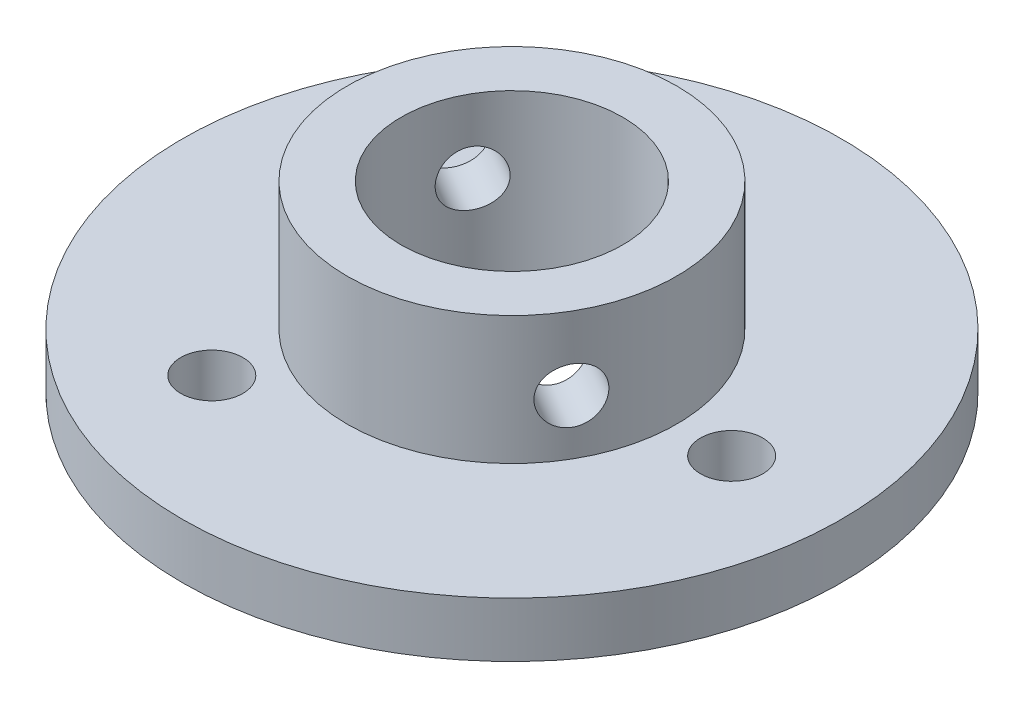
ISO-10303-21;
HEADER;
FILE_DESCRIPTION(('STEP AP214'),'2;1');
FILE_NAME('part.step','',(''),(''),'','','');
FILE_SCHEMA(('AUTOMOTIVE_DESIGN { 1 0 10303 214 1 1 1 1 }'));
ENDSEC;
DATA;
#1=APPLICATION_CONTEXT('core data for automotive mechanical design processes');
#2=APPLICATION_PROTOCOL_DEFINITION('international standard','automotive_design',2000,#1);
#3=PRODUCT_CONTEXT('',#1,'mechanical');
#4=PRODUCT('Part','Part','',(#3));
#5=PRODUCT_RELATED_PRODUCT_CATEGORY('part','',(#4));
#6=PRODUCT_DEFINITION_FORMATION('','',#4);
#7=PRODUCT_DEFINITION_CONTEXT('part definition',#1,'design');
#8=PRODUCT_DEFINITION('design','',#6,#7);
#9=PRODUCT_DEFINITION_SHAPE('','',#8);
#10=(LENGTH_UNIT() NAMED_UNIT(*) SI_UNIT(.MILLI.,.METRE.));
#11=(NAMED_UNIT(*) PLANE_ANGLE_UNIT() SI_UNIT($,.RADIAN.));
#12=(NAMED_UNIT(*) SI_UNIT($,.STERADIAN.) SOLID_ANGLE_UNIT());
#13=UNCERTAINTY_MEASURE_WITH_UNIT(LENGTH_MEASURE(1.E-05),#10,'distance_accuracy_value','');
#14=(GEOMETRIC_REPRESENTATION_CONTEXT(3) GLOBAL_UNCERTAINTY_ASSIGNED_CONTEXT((#13)) GLOBAL_UNIT_ASSIGNED_CONTEXT((#10,
#11,#12)) REPRESENTATION_CONTEXT('',''));
#15=CARTESIAN_POINT('',(0.,0.,0.));
#16=DIRECTION('',(0.,0.,1.));
#17=DIRECTION('',(1.,0.,0.));
#18=AXIS2_PLACEMENT_3D('',#15,#16,#17);
#19=CARTESIAN_POINT('',(-19.0091828831705,263.,-53.2448828787845));
#20=DIRECTION('',(0.,1.,0.));
#21=DIRECTION('',(0.,0.,-1.));
#22=AXIS2_PLACEMENT_3D('',#19,#20,#21);
#23=CYLINDRICAL_SURFACE('',#22,9.);
#24=CARTESIAN_POINT('',(-19.0091828831705,273.,-53.2448828787845));
#25=DIRECTION('',(0.,1.,0.));
#26=DIRECTION('',(0.,0.,1.));
#27=AXIS2_PLACEMENT_3D('',#24,#25,#26);
#28=CIRCLE('',#27,9.);
#29=CARTESIAN_POINT('',(-19.0091828831705,273.,-44.2448828787845));
#30=VERTEX_POINT('',#29);
#31=EDGE_CURVE('E55',#30,#30,#28,.T.);
#32=ORIENTED_EDGE('',*,*,#31,.F.);
#33=EDGE_LOOP('',(#32));
#34=FACE_BOUND('',#33,.T.);
#35=CARTESIAN_POINT('',(-19.0091828831705,266.,-53.2448828787845));
#36=DIRECTION('',(0.,1.,0.));
#37=DIRECTION('',(0.,0.,1.));
#38=AXIS2_PLACEMENT_3D('',#35,#36,#37);
#39=CIRCLE('',#38,9.);
#40=CARTESIAN_POINT('',(-19.0091828831705,266.,-44.2448828787845));
#41=VERTEX_POINT('',#40);
#42=EDGE_CURVE('E10',#41,#41,#39,.T.);
#43=ORIENTED_EDGE('',*,*,#42,.T.);
#44=EDGE_LOOP('',(#43));
#45=FACE_BOUND('',#44,.T.);
#46=CARTESIAN_POINT('',(-27.4443959576402,269.,-56.3829046104325));
#47=CARTESIAN_POINT('',(-27.4443955846555,268.916374551112,-56.3829082759775));
#48=CARTESIAN_POINT('',(-27.4419223053393,268.832703436385,-56.389578863176));
#49=CARTESIAN_POINT('',(-27.4320125045344,268.667708874068,-56.4160235195044));
#50=CARTESIAN_POINT('',(-27.4245714058764,268.58638766375,-56.435809672723));
#51=CARTESIAN_POINT('',(-27.4047027066641,268.428504629986,-56.4877233004097));
#52=CARTESIAN_POINT('',(-27.3922792732431,268.3519388908,-56.5198404604949));
#53=CARTESIAN_POINT('',(-27.3624238402235,268.205611427172,-56.5952563986755));
#54=CARTESIAN_POINT('',(-27.3449924042401,268.135848938254,-56.6385539184453));
#55=CARTESIAN_POINT('',(-27.3049570017537,268.004412290153,-56.7352822711148));
#56=CARTESIAN_POINT('',(-27.2823087569628,267.942814921168,-56.7887991358885));
#57=CARTESIAN_POINT('',(-27.2320296164232,267.830124015883,-56.9039443219727));
#58=CARTESIAN_POINT('',(-27.2043984255415,267.779031102131,-56.9655731236835));
#59=CARTESIAN_POINT('',(-27.1442291954822,267.688511259668,-57.0953581877246));
#60=CARTESIAN_POINT('',(-27.1116628481623,267.649155795361,-57.1635512212972));
#61=CARTESIAN_POINT('',(-27.042228374785,267.583687357682,-57.303984791282));
#62=CARTESIAN_POINT('',(-27.0053605286255,267.557573523269,-57.376225064182));
#63=CARTESIAN_POINT('',(-26.9284317459557,267.51956447901,-57.5218223073512));
#64=CARTESIAN_POINT('',(-26.8884034241198,267.507540250397,-57.5951628151509));
#65=CARTESIAN_POINT('',(-26.8058722650729,267.497650547508,-57.7414016906102));
#66=CARTESIAN_POINT('',(-26.763369596251,267.499784110852,-57.8143000879852));
#67=CARTESIAN_POINT('',(-26.6775772460358,267.518048810917,-57.9568445310038));
#68=CARTESIAN_POINT('',(-26.6342995292368,267.534041098046,-58.0265156384673));
#69=CARTESIAN_POINT('',(-26.5479566930274,267.579350644548,-58.1615193586023));
#70=CARTESIAN_POINT('',(-26.5048915801325,267.608668309754,-58.226851839069));
#71=CARTESIAN_POINT('',(-26.4202928553399,267.679934384189,-58.3518562486502));
#72=CARTESIAN_POINT('',(-26.3787671579525,267.721940007249,-58.4115008921241));
#73=CARTESIAN_POINT('',(-26.2990161854585,267.817347693581,-58.523430077372));
#74=CARTESIAN_POINT('',(-26.2607911778246,267.870750679227,-58.5757140228853));
#75=CARTESIAN_POINT('',(-26.1887295067824,267.988207283972,-58.6723865701703));
#76=CARTESIAN_POINT('',(-26.1549517092287,268.052382256941,-58.7166716896824));
#77=CARTESIAN_POINT('',(-26.0937997144255,268.18915225413,-58.7956220923109));
#78=CARTESIAN_POINT('',(-26.066425576245,268.26174735601,-58.8302872866911));
#79=CARTESIAN_POINT('',(-26.0193142215111,268.413434985127,-58.8893042877897));
#80=CARTESIAN_POINT('',(-25.9995855931814,268.492534698855,-58.9136444993096));
#81=CARTESIAN_POINT('',(-25.9687753955772,268.654909443385,-58.9514293115988));
#82=CARTESIAN_POINT('',(-25.9576930649258,268.73818410586,-58.9648748717346));
#83=CARTESIAN_POINT('',(-25.9448151899855,268.905479693697,-58.9804828538303));
#84=CARTESIAN_POINT('',(-25.9429103119665,268.989479827821,-58.98277811538));
#85=CARTESIAN_POINT('',(-25.9481869744816,269.156772003015,-58.9763956560938));
#86=CARTESIAN_POINT('',(-25.9553681640573,269.240064071308,-58.9677183590838));
#87=CARTESIAN_POINT('',(-25.9783808858867,269.403036655515,-58.9396700995327));
#88=CARTESIAN_POINT('',(-25.9941574120271,269.482736683927,-58.9203671282506));
#89=CARTESIAN_POINT('',(-26.0335649390486,269.636882099768,-58.8715191422945));
#90=CARTESIAN_POINT('',(-26.0571964097995,269.711327172531,-58.8419735149173));
#91=CARTESIAN_POINT('',(-26.1114846218793,269.853604756644,-58.7729249574249));
#92=CARTESIAN_POINT('',(-26.1422041504897,269.921369943654,-58.7333326995224));
#93=CARTESIAN_POINT('',(-26.2092002877539,270.047668119617,-58.6451429188243));
#94=CARTESIAN_POINT('',(-26.2454772872466,270.106200458666,-58.5965447626223));
#95=CARTESIAN_POINT('',(-26.3224923998484,270.212991135637,-58.4908162898407));
#96=CARTESIAN_POINT('',(-26.3632729839541,270.261136295771,-58.433602496924));
#97=CARTESIAN_POINT('',(-26.4473588613692,270.344993196203,-58.3123255181014));
#98=CARTESIAN_POINT('',(-26.490664072959,270.380705338684,-58.2482625538398));
#99=CARTESIAN_POINT('',(-26.5779837345088,270.438506350373,-58.115155549931));
#100=CARTESIAN_POINT('',(-26.6219942274918,270.460654445441,-58.0461346567948));
#101=CARTESIAN_POINT('',(-26.7093803081369,270.490889359378,-57.9046967084631));
#102=CARTESIAN_POINT('',(-26.7527559477492,270.498977335239,-57.8322799332145));
#103=CARTESIAN_POINT('',(-26.8369936083392,270.500829129387,-57.6869934454136));
#104=CARTESIAN_POINT('',(-26.8778797003691,270.494765152365,-57.6141398263318));
#105=CARTESIAN_POINT('',(-26.9566077376737,270.468857646638,-57.4692453820966));
#106=CARTESIAN_POINT('',(-26.994449699993,270.449014195094,-57.3972045523942));
#107=CARTESIAN_POINT('',(-27.0662175392359,270.396177100674,-57.2561733620671));
#108=CARTESIAN_POINT('',(-27.1001477222312,270.363198099074,-57.1871796997767));
#109=CARTESIAN_POINT('',(-27.1635774092855,270.285045238262,-57.05425033712));
#110=CARTESIAN_POINT('',(-27.1930767032088,270.239870800963,-56.9903148767077));
#111=CARTESIAN_POINT('',(-27.2476192889897,270.137998944523,-56.8687840044083));
#112=CARTESIAN_POINT('',(-27.2726076517893,270.081175427146,-56.8112696296225));
#113=CARTESIAN_POINT('',(-27.3175452583329,269.957883015261,-56.7052927569666));
#114=CARTESIAN_POINT('',(-27.3374933204094,269.891411864665,-56.6568323824438));
#115=CARTESIAN_POINT('',(-27.3724177907865,269.750152806495,-56.5703152260012));
#116=CARTESIAN_POINT('',(-27.3873580339418,269.675309396097,-56.5323344587124));
#117=CARTESIAN_POINT('',(-27.4120729545346,269.519834458453,-56.468640867427));
#118=CARTESIAN_POINT('',(-27.4218527931616,269.439208806382,-56.4429157883894));
#119=CARTESIAN_POINT('',(-27.4341856321772,269.298557738314,-56.4102470016508));
#120=CARTESIAN_POINT('',(-27.4380145649149,269.239383915225,-56.4000136386093));
#121=CARTESIAN_POINT('',(-27.4431198384733,269.120147909095,-56.3863411878055));
#122=CARTESIAN_POINT('',(-27.4443962256336,269.060085742202,-56.3829019767009));
#123=CARTESIAN_POINT('',(-27.4443959576402,269.,-56.3829046104325));
#124=B_SPLINE_CURVE_WITH_KNOTS('',3,(#46,#47,#48,#49,#50,#51,#52,#53,#54,#55,#56,#57,#58,#59,
#60,#61,#62,#63,#64,#65,#66,#67,#68,#69,#70,#71,#72,#73,#74,#75,#76,#77,#78,#79,#80,#81,#82,#83,
#84,#85,#86,#87,#88,#89,#90,#91,#92,#93,#94,#95,#96,#97,#98,#99,#100,#101,#102,#103,#104,#105,
#106,#107,#108,#109,#110,#111,#112,#113,#114,#115,#116,#117,#118,#119,#120,#121,#122,#123),
.UNSPECIFIED.,.T.,.F.,(4,2,2,2,2,2,2,2,2,2,2,2,2,2,2,2,2,2,2,2,2,2,2,2,2,2,2,2,2,2,2,2,2,2,2,2,
2,2,4),(0.,0.250656623343192,0.501544511951688,0.75222299869901,1.00287328440552,
1.25573495490819,1.5086116069806,1.76299788064252,2.01736761064057,2.26938940480931,
2.52139406789009,2.77090272696194,3.02041898547112,3.27107762481046,3.52175655733452,
3.77547674074667,4.02919926444999,4.28320597496554,4.5371903156024,4.78814125449642,
5.03908250045775,5.28843638778686,5.53780519373538,5.7894740565501,6.04116062655806,
6.29546467818619,6.54976050283407,6.80293790647976,7.05609447544802,7.30618665756942,
7.55627743928687,7.80609023896866,8.05591488232793,8.30860198475348,8.56134827326482,
8.81588236567711,9.07016140042584,9.25026402322166,9.43036337636995),.UNSPECIFIED.);
#125=CARTESIAN_POINT('',(-27.4443959576402,269.,-56.3829046104325));
#126=VERTEX_POINT('',#125);
#127=EDGE_CURVE('E122',#126,#126,#124,.T.);
#128=ORIENTED_EDGE('',*,*,#127,.T.);
#129=EDGE_LOOP('',(#128));
#130=FACE_BOUND('',#129,.T.);
#131=CARTESIAN_POINT('',(-12.0739698087008,269.,-47.5087849357831));
#132=CARTESIAN_POINT('',(-12.0739668207381,269.083625448888,-47.5087870915698));
#133=CARTESIAN_POINT('',(-12.0694265624242,269.167296563615,-47.5142643078876));
#134=CARTESIAN_POINT('',(-12.0514797186519,269.332291125932,-47.5360687752953));
#135=CARTESIAN_POINT('',(-12.0380649566504,269.41361233625,-47.5524060323744));
#136=CARTESIAN_POINT('',(-12.0030407858772,269.571495370014,-47.5955696444758));
#137=CARTESIAN_POINT('',(-11.9814382260566,269.6480611092,-47.6223872334632));
#138=CARTESIAN_POINT('',(-11.9310538242517,269.794388572828,-47.6859507659894));
#139=CARTESIAN_POINT('',(-11.9022727902019,269.864151061746,-47.7226955922605));
#140=CARTESIAN_POINT('',(-11.8385212807671,269.995587709847,-47.8057314441991));
#141=CARTESIAN_POINT('',(-11.8034984387377,270.057185078832,-47.8521038319261));
#142=CARTESIAN_POINT('',(-11.7289193527351,270.169875984117,-47.9532194379559));
#143=CARTESIAN_POINT('',(-11.6893628402895,270.220968897869,-48.0079631520517));
#144=CARTESIAN_POINT('',(-11.6070502928279,270.311488740332,-48.1249637658297));
#145=CARTESIAN_POINT('',(-11.5642765670528,270.350844204639,-48.1872635667035));
#146=CARTESIAN_POINT('',(-11.4773747645904,270.416312642318,-48.3176123695391));
#147=CARTESIAN_POINT('',(-11.4332467761624,270.442426476731,-48.385660997346));
#148=CARTESIAN_POINT('',(-11.3456202561919,270.48043552099,-48.5250818990049));
#149=CARTESIAN_POINT('',(-11.3021196742288,270.492459749603,-48.5964176964855));
#150=CARTESIAN_POINT('',(-11.2167386725836,270.502349452492,-48.7410112145535));
#151=CARTESIAN_POINT('',(-11.1748581429726,270.500215889148,-48.8142688041694));
#152=CARTESIAN_POINT('',(-11.0943072092579,270.481951189083,-48.9598393804154));
#153=CARTESIAN_POINT('',(-11.0556091186842,270.465958901955,-49.0321545363129));
#154=CARTESIAN_POINT('',(-10.9818638855465,270.420649355452,-49.1744314859725));
#155=CARTESIAN_POINT('',(-10.9468168542176,270.391331690246,-49.2443932079897));
#156=CARTESIAN_POINT('',(-10.8808592223315,270.320065615811,-49.3801600575784));
#157=CARTESIAN_POINT('',(-10.8499682945772,270.278059992751,-49.4459446881628));
#158=CARTESIAN_POINT('',(-10.7929102629745,270.182652306419,-49.570975648943));
#159=CARTESIAN_POINT('',(-10.7667435417669,270.129249320773,-49.6302214493705));
#160=CARTESIAN_POINT('',(-10.7190534954907,270.011792716028,-49.7409649607747));
#161=CARTESIAN_POINT('',(-10.6975903557604,269.947617743059,-49.7923599512962));
#162=CARTESIAN_POINT('',(-10.6597932988467,269.81084774587,-49.8847943336021));
#163=CARTESIAN_POINT('',(-10.6434594289765,269.73825264399,-49.9258336298632));
#164=CARTESIAN_POINT('',(-10.615904884137,269.586565014873,-49.9961417604188));
#165=CARTESIAN_POINT('',(-10.6046899567921,269.507465301145,-50.025397359494));
#166=CARTESIAN_POINT('',(-10.5873724482745,269.345090556616,-50.0709721794595));
#167=CARTESIAN_POINT('',(-10.5812694169545,269.261815894141,-50.0872925394047));
#168=CARTESIAN_POINT('',(-10.574191445428,269.094520306303,-50.1062490972976));
#169=CARTESIAN_POINT('',(-10.5731561296271,269.010520172179,-50.109046400828));
#170=CARTESIAN_POINT('',(-10.57604517025,268.843227996985,-50.1012854473996));
#171=CARTESIAN_POINT('',(-10.579969335109,268.759935928692,-50.0907277062927));
#172=CARTESIAN_POINT('',(-10.5927534794975,268.596963344485,-50.0567739748026));
#173=CARTESIAN_POINT('',(-10.6015820799261,268.517263316073,-50.0334596167405));
#174=CARTESIAN_POINT('',(-10.6241819131771,268.363117900232,-49.9749077042615));
#175=CARTESIAN_POINT('',(-10.637953441681,268.288672827469,-49.9396694365739));
#176=CARTESIAN_POINT('',(-10.6706071405242,268.146395243356,-49.8581301870405));
#177=CARTESIAN_POINT('',(-10.6895352773557,268.078630056346,-49.8117301659203));
#178=CARTESIAN_POINT('',(-10.7324117991624,267.952331880383,-49.7096149187451));
#179=CARTESIAN_POINT('',(-10.756360537264,267.893799541334,-49.6538990375103));
#180=CARTESIAN_POINT('',(-10.8094165242954,267.787008864363,-49.5343377571311));
#181=CARTESIAN_POINT('',(-10.8385748303552,267.738863704229,-49.470413838856));
#182=CARTESIAN_POINT('',(-10.9015608362023,267.655006803797,-49.3369548435037));
#183=CARTESIAN_POINT('',(-10.9353883848997,267.619294661316,-49.2674199480199));
#184=CARTESIAN_POINT('',(-11.0070026009314,267.561493649627,-49.1252454009135));
#185=CARTESIAN_POINT('',(-11.0447712012877,267.539345554559,-49.0526207493891));
#186=CARTESIAN_POINT('',(-11.1235670172796,267.509110640622,-48.9062232094474));
#187=CARTESIAN_POINT('',(-11.1645939644989,267.501022664761,-48.8324504160134));
#188=CARTESIAN_POINT('',(-11.2482969234661,267.499170870613,-48.6868552180867));
#189=CARTESIAN_POINT('',(-11.2909469623336,267.505234847635,-48.6150200141864));
#190=CARTESIAN_POINT('',(-11.3770652132562,267.531142353362,-48.4743923117729));
#191=CARTESIAN_POINT('',(-11.4205334207286,267.550985804906,-48.4055997962242));
#192=CARTESIAN_POINT('',(-11.5067860946564,267.603822899326,-48.2729314291016));
#193=CARTESIAN_POINT('',(-11.5495712674023,267.636801900926,-48.2090501975274));
#194=CARTESIAN_POINT('',(-11.6329766288447,267.714954761738,-48.0876537958559));
#195=CARTESIAN_POINT('',(-11.6735967148027,267.760129199037,-48.0301389277185));
#196=CARTESIAN_POINT('',(-11.7515742446677,267.862001055477,-47.9221382266944));
#197=CARTESIAN_POINT('',(-11.7888889729152,267.918824572854,-47.8717404823181));
#198=CARTESIAN_POINT('',(-11.858198833577,268.042116984739,-47.7798349371381));
#199=CARTESIAN_POINT('',(-11.8901927179524,268.108588135335,-47.7383292213622));
#200=CARTESIAN_POINT('',(-11.9476565381064,268.249847193505,-47.6648251645806));
#201=CARTESIAN_POINT('',(-11.973078725856,268.324690603903,-47.632896150825));
#202=CARTESIAN_POINT('',(-12.015881533671,268.480165541547,-47.5796456060964));
#203=CARTESIAN_POINT('',(-12.0332701863185,268.560791193618,-47.5583134778818));
#204=CARTESIAN_POINT('',(-12.0553957660371,268.701442261686,-47.5312985326241));
#205=CARTESIAN_POINT('',(-12.0623436520284,268.760616084775,-47.5228658980832));
#206=CARTESIAN_POINT('',(-12.0716317049772,268.879852090905,-47.5116083760864));
#207=CARTESIAN_POINT('',(-12.0739719555826,268.939914257798,-47.5087833868283));
#208=CARTESIAN_POINT('',(-12.0739698087008,269.,-47.5087849357831));
#209=B_SPLINE_CURVE_WITH_KNOTS('',3,(#131,#132,#133,#134,#135,#136,#137,#138,#139,#140,#141,
#142,#143,#144,#145,#146,#147,#148,#149,#150,#151,#152,#153,#154,#155,#156,#157,#158,#159,#160,
#161,#162,#163,#164,#165,#166,#167,#168,#169,#170,#171,#172,#173,#174,#175,#176,#177,#178,#179,
#180,#181,#182,#183,#184,#185,#186,#187,#188,#189,#190,#191,#192,#193,#194,#195,#196,#197,#198,
#199,#200,#201,#202,#203,#204,#205,#206,#207,#208),.UNSPECIFIED.,.T.,.F.,(4,2,2,2,2,2,2,2,2,2,2,
2,2,2,2,2,2,2,2,2,2,2,2,2,2,2,2,2,2,2,2,2,2,2,2,2,2,2,4),(0.,0.250656623343192,
0.501544511951688,0.75222299869901,1.00287328440552,1.25573495490819,1.5086116069806,
1.76299788064251,2.01736761064058,2.26938940480931,2.52139406789008,2.77090272696194,
3.02041898547112,3.27107762481046,3.52175655733452,3.77547674074669,4.02919926445006,
4.28320597496555,4.53719031560235,4.78814125449637,5.03908250045781,5.28843638778687,
5.53780519373538,5.78947405655011,6.04116062655806,6.2954646781862,6.54976050283408,
6.80293790647979,7.05609447544804,7.30618665756944,7.55627743928688,7.80609023896868,
8.05591488232794,8.30860198475347,8.56134827326483,8.81588236567717,9.07016140042584,
9.25026402322172,9.43036337636996),.UNSPECIFIED.);
#210=CARTESIAN_POINT('',(-12.0739698087008,269.,-47.5087849357831));
#211=VERTEX_POINT('',#210);
#212=EDGE_CURVE('E68',#211,#211,#209,.T.);
#213=ORIENTED_EDGE('',*,*,#212,.T.);
#214=EDGE_LOOP('',(#213));
#215=FACE_BOUND('',#214,.T.);
#216=ADVANCED_FACE('F39',(#34,#45,#130,#215),#23,.T.);
#217=CARTESIAN_POINT('',(-19.0091828831705,262.9,-53.2448828787845));
#218=DIRECTION('',(0.,1.,0.));
#219=DIRECTION('',(0.,0.,-1.));
#220=AXIS2_PLACEMENT_3D('',#217,#218,#219);
#221=CYLINDRICAL_SURFACE('',#220,6.05);
#222=CARTESIAN_POINT('',(-24.8350448789305,269.,-54.8763950627292));
#223=CARTESIAN_POINT('',(-24.8350450633985,268.917145871372,-54.8763979320863));
#224=CARTESIAN_POINT('',(-24.8331388938054,268.83426511614,-54.8832484358918));
#225=CARTESIAN_POINT('',(-24.8254452254222,268.670882052661,-54.9103509568516));
#226=CARTESIAN_POINT('',(-24.8196554299351,268.590381181258,-54.930610903983));
#227=CARTESIAN_POINT('',(-24.8040130372753,268.434144766549,-54.9836182037655));
#228=CARTESIAN_POINT('',(-24.7941656282341,268.358403279826,-55.0163496061995));
#229=CARTESIAN_POINT('',(-24.7701365726022,268.213569094319,-55.092995111845));
#230=CARTESIAN_POINT('',(-24.7559547606416,268.144476649346,-55.136909641714));
#231=CARTESIAN_POINT('',(-24.7226346416272,268.013406159432,-55.2352876924835));
#232=CARTESIAN_POINT('',(-24.7034050162067,267.951593249911,-55.2899403392969));
#233=CARTESIAN_POINT('',(-24.6598652875304,267.838290682976,-55.4073354940556));
#234=CARTESIAN_POINT('',(-24.6355547156717,267.786801978596,-55.4700787479727));
#235=CARTESIAN_POINT('',(-24.5813733602019,267.694935328621,-55.6025030570667));
#236=CARTESIAN_POINT('',(-24.5514309218313,267.654719373618,-55.6722674293788));
#237=CARTESIAN_POINT('',(-24.4863792754456,267.587592712703,-55.8156824422294));
#238=CARTESIAN_POINT('',(-24.451270817782,267.560680076987,-55.8893325173844));
#239=CARTESIAN_POINT('',(-24.3771809586197,267.521452276688,-56.0366123488901));
#240=CARTESIAN_POINT('',(-24.3382907397042,267.508856747212,-56.1102132286142));
#241=CARTESIAN_POINT('',(-24.2569934948733,267.497740893098,-56.2565241740754));
#242=CARTESIAN_POINT('',(-24.2145869815761,267.499218520387,-56.3292343678923));
#243=CARTESIAN_POINT('',(-24.1285014330235,267.516004889703,-56.4700563567304));
#244=CARTESIAN_POINT('',(-24.0848703763516,267.531011035916,-56.5382338805729));
#245=CARTESIAN_POINT('',(-23.9969491341835,267.573942381363,-56.6699318903674));
#246=CARTESIAN_POINT('',(-23.9526589140462,267.601868261907,-56.7334521305176));
#247=CARTESIAN_POINT('',(-23.8646572595089,267.670092763352,-56.8549452882894));
#248=CARTESIAN_POINT('',(-23.8209545153478,267.710499557116,-56.9128636528494));
#249=CARTESIAN_POINT('',(-23.736264902453,267.802456929857,-57.0213813356442));
#250=CARTESIAN_POINT('',(-23.6952785008274,267.854009419009,-57.0719793968246));
#251=CARTESIAN_POINT('',(-23.6167176125377,267.968418739372,-57.1662338103556));
#252=CARTESIAN_POINT('',(-23.5792630410344,268.031540031227,-57.2096694401291));
#253=CARTESIAN_POINT('',(-23.5108334886642,268.166447544473,-57.2871994740126));
#254=CARTESIAN_POINT('',(-23.4798588005152,268.238234157074,-57.3212934561507));
#255=CARTESIAN_POINT('',(-23.4258881891325,268.388921008808,-57.3797118605887));
#256=CARTESIAN_POINT('',(-23.402930465209,268.467853107807,-57.403989594661));
#257=CARTESIAN_POINT('',(-23.366540965744,268.630299513716,-57.4421000954008));
#258=CARTESIAN_POINT('',(-23.3531071897388,268.713812854385,-57.4559350555668));
#259=CARTESIAN_POINT('',(-23.3368161357506,268.88072474514,-57.4726747893412));
#260=CARTESIAN_POINT('',(-23.3336930087933,268.964069849902,-57.4758543346462));
#261=CARTESIAN_POINT('',(-23.3374677961823,269.130289310283,-57.4719926504449));
#262=CARTESIAN_POINT('',(-23.3443648049192,269.213163707763,-57.4649523445981));
#263=CARTESIAN_POINT('',(-23.3675655787072,269.374718130252,-57.4409844251751));
#264=CARTESIAN_POINT('',(-23.3837167785055,269.453444096,-57.424217117048));
#265=CARTESIAN_POINT('',(-23.4243967755724,269.605990866611,-57.3812166133983));
#266=CARTESIAN_POINT('',(-23.4489265526,269.679811096609,-57.3549823108211));
#267=CARTESIAN_POINT('',(-23.5056335718447,269.822024713169,-57.2928733449973));
#268=CARTESIAN_POINT('',(-23.5379494671799,269.89028562448,-57.2568221448304));
#269=CARTESIAN_POINT('',(-23.6083755456353,270.018024313333,-57.1758876509572));
#270=CARTESIAN_POINT('',(-23.6464866644314,270.077500669491,-57.1310029306775));
#271=CARTESIAN_POINT('',(-23.727772536656,270.187479914155,-57.0319147257517));
#272=CARTESIAN_POINT('',(-23.7710486775083,270.237726490308,-56.9775094175847));
#273=CARTESIAN_POINT('',(-23.8599666809402,270.325960338467,-56.8611996532621));
#274=CARTESIAN_POINT('',(-23.9056084205376,270.363948247033,-56.7992955867269));
#275=CARTESIAN_POINT('',(-23.9970265289423,270.426259322716,-56.6698127715526));
#276=CARTESIAN_POINT('',(-24.0427994860794,270.450680162875,-56.6022787192659));
#277=CARTESIAN_POINT('',(-24.1330462688226,270.485458073156,-56.4628653761341));
#278=CARTESIAN_POINT('',(-24.1775203391816,270.495817809803,-56.3909869118577));
#279=CARTESIAN_POINT('',(-24.2624923341831,270.502031514408,-56.2468908046009));
#280=CARTESIAN_POINT('',(-24.3030645594155,270.498264033302,-56.1747330503417));
#281=CARTESIAN_POINT('',(-24.3804265364585,270.477195886485,-56.030371866503));
#282=CARTESIAN_POINT('',(-24.4172163973577,270.459895611202,-55.9581684383013));
#283=CARTESIAN_POINT('',(-24.486095370606,270.412454589756,-55.8162875322755));
#284=CARTESIAN_POINT('',(-24.5182079972697,270.382381278526,-55.7465988450935));
#285=CARTESIAN_POINT('',(-24.5775998405927,270.310309234355,-55.6114599557539));
#286=CARTESIAN_POINT('',(-24.6048784561424,270.268309019989,-55.5460102813589));
#287=CARTESIAN_POINT('',(-24.6551214184374,270.172415313698,-55.4198771609174));
#288=CARTESIAN_POINT('',(-24.6779686269354,270.118264305729,-55.3593428307888));
#289=CARTESIAN_POINT('',(-24.7186879397711,270.000107510859,-55.2467925003856));
#290=CARTESIAN_POINT('',(-24.7365587866343,269.936099239464,-55.1947786545129));
#291=CARTESIAN_POINT('',(-24.7678858849438,269.798637306859,-55.1002456268818));
#292=CARTESIAN_POINT('',(-24.7812555255557,269.725032456485,-55.0579172542834));
#293=CARTESIAN_POINT('',(-24.803444606581,269.571354258327,-54.9857068801794));
#294=CARTESIAN_POINT('',(-24.8122673975113,269.491285724021,-54.9558157169866));
#295=CARTESIAN_POINT('',(-24.8243633753481,269.34278419005,-54.9141780976986));
#296=CARTESIAN_POINT('',(-24.8283768790743,269.275069134371,-54.9000496540044));
#297=CARTESIAN_POINT('',(-24.8337174434205,269.138242154339,-54.8811573246245));
#298=CARTESIAN_POINT('',(-24.8350447250173,269.069130345359,-54.8763926686464));
#299=CARTESIAN_POINT('',(-24.8350448789305,269.,-54.8763950627292));
#300=B_SPLINE_CURVE_WITH_KNOTS('',3,(#222,#223,#224,#225,#226,#227,#228,#229,#230,#231,#232,
#233,#234,#235,#236,#237,#238,#239,#240,#241,#242,#243,#244,#245,#246,#247,#248,#249,#250,#251,
#252,#253,#254,#255,#256,#257,#258,#259,#260,#261,#262,#263,#264,#265,#266,#267,#268,#269,#270,
#271,#272,#273,#274,#275,#276,#277,#278,#279,#280,#281,#282,#283,#284,#285,#286,#287,#288,#289,
#290,#291,#292,#293,#294,#295,#296,#297,#298,#299),.UNSPECIFIED.,.T.,.F.,(4,2,2,2,2,2,2,2,2,2,2,
2,2,2,2,2,2,2,2,2,2,2,2,2,2,2,2,2,2,2,2,2,2,2,2,2,2,2,4),(0.,0.248308555378135,
0.496764084985487,0.744902916216995,0.993051215830459,1.24604175182043,1.49905563079245,
1.75553800799941,2.01198316847504,2.26331496642091,2.51461018850565,2.7604203878838,
3.00624355129862,3.25426007800213,3.50231914408442,3.75698358308596,4.01165952364873,
4.26753289950156,4.52335251433646,4.77252234046924,5.0216696482933,5.26682305522699,
5.5120051392892,5.76192634197366,6.01188793896218,6.26798960627747,6.52407797276703,
6.77829797232378,7.03246975527181,7.27988006564556,7.52728323836721,7.77339617740614,
8.01953969916321,8.271497849543,8.52351960945305,8.78014536003374,9.03658173491867,
9.24377802972126,9.45095727924298),.UNSPECIFIED.);
#301=CARTESIAN_POINT('',(-24.8350448789305,269.,-54.8763950627292));
#302=VERTEX_POINT('',#301);
#303=EDGE_CURVE('E80',#302,#302,#300,.T.);
#304=ORIENTED_EDGE('',*,*,#303,.F.);
#305=EDGE_LOOP('',(#304));
#306=FACE_BOUND('',#305,.T.);
#307=CARTESIAN_POINT('',(-19.0091828831705,263.,-53.2448828787845));
#308=DIRECTION('',(0.,1.,0.));
#309=DIRECTION('',(0.,0.,1.));
#310=AXIS2_PLACEMENT_3D('',#307,#308,#309);
#311=CIRCLE('',#310,6.05);
#312=CARTESIAN_POINT('',(-19.0091828831705,263.,-47.1948828787845));
#313=VERTEX_POINT('',#312);
#314=EDGE_CURVE('E62',#313,#313,#311,.F.);
#315=ORIENTED_EDGE('',*,*,#314,.T.);
#316=EDGE_LOOP('',(#315));
#317=FACE_BOUND('',#316,.T.);
#318=CARTESIAN_POINT('',(-19.0091828831705,273.,-53.2448828787845));
#319=DIRECTION('',(0.,1.,0.));
#320=DIRECTION('',(0.,0.,1.));
#321=AXIS2_PLACEMENT_3D('',#318,#319,#320);
#322=CIRCLE('',#321,6.05);
#323=CARTESIAN_POINT('',(-19.0091828831705,273.,-47.1948828787845));
#324=VERTEX_POINT('',#323);
#325=EDGE_CURVE('E61',#324,#324,#322,.F.);
#326=ORIENTED_EDGE('',*,*,#325,.F.);
#327=EDGE_LOOP('',(#326));
#328=FACE_BOUND('',#327,.T.);
#329=CARTESIAN_POINT('',(-14.6833208874106,269.,-49.0152944834864));
#330=CARTESIAN_POINT('',(-14.6833183102404,269.082854128628,-49.0152957584109));
#331=CARTESIAN_POINT('',(-14.6783386847127,269.16573488386,-49.0203718016053));
#332=CARTESIAN_POINT('',(-14.6587140472465,269.329117947339,-49.0405859743533));
#333=CARTESIAN_POINT('',(-14.644063316095,269.409618818742,-49.0557300578936));
#334=CARTESIAN_POINT('',(-14.6059788442272,269.565855233451,-49.0957804172042));
#335=CARTESIAN_POINT('',(-14.5825563227385,269.641596720174,-49.1206742248123));
#336=CARTESIAN_POINT('',(-14.5281938955795,269.786430905681,-49.1798067502413));
#337=CARTESIAN_POINT('',(-14.497253703098,269.855523350654,-49.2140458246053));
#338=CARTESIAN_POINT('',(-14.428715871464,269.986593840568,-49.2920909195136));
#339=CARTESIAN_POINT('',(-14.3910001036498,270.048406750089,-49.3360705870397));
#340=CARTESIAN_POINT('',(-14.3111027816857,270.161709317024,-49.4324746755267));
#341=CARTESIAN_POINT('',(-14.2689208158068,270.213198021404,-49.4848998752954));
#342=CARTESIAN_POINT('',(-14.1813286777876,270.305064671379,-49.5980344600907));
#343=CARTESIAN_POINT('',(-14.1358821782716,270.345280626382,-49.6588475585269));
#344=CARTESIAN_POINT('',(-14.0442069570517,270.412407287297,-49.7868914432803));
#345=CARTESIAN_POINT('',(-13.9979783498087,270.439319923013,-49.8541212970821));
#346=CARTESIAN_POINT('',(-13.9074752038408,270.478547723312,-49.9919249130324));
#347=CARTESIAN_POINT('',(-13.8631800817166,270.491143252788,-50.062405270434));
#348=CARTESIAN_POINT('',(-13.777119708511,270.502259106902,-50.2059662224458));
#349=CARTESIAN_POINT('',(-13.7353540902,270.500781479613,-50.2790464371555));
#350=CARTESIAN_POINT('',(-13.656441444731,270.483995110297,-50.4240097035199));
#351=CARTESIAN_POINT('',(-13.6192135054523,270.468988964084,-50.4958840689129));
#352=CARTESIAN_POINT('',(-13.5491203044264,270.426057618637,-50.63787510306));
#353=CARTESIAN_POINT('',(-13.5162552728705,270.398131738093,-50.7079916789133));
#354=CARTESIAN_POINT('',(-13.4550399391228,270.329907236648,-50.8449499262035));
#355=CARTESIAN_POINT('',(-13.4267325361488,270.289500442884,-50.9117567951421));
#356=CARTESIAN_POINT('',(-13.375098272536,270.197543070143,-51.0393589927431));
#357=CARTESIAN_POINT('',(-13.3517722669844,270.145990580991,-51.1001532883508));
#358=CARTESIAN_POINT('',(-13.3094259945926,270.031581260628,-51.215316220119));
#359=CARTESIAN_POINT('',(-13.290536921531,269.968459968773,-51.2694706454154));
#360=CARTESIAN_POINT('',(-13.2576087188167,269.833552455527,-51.3674973930794));
#361=CARTESIAN_POINT('',(-13.2435698082435,269.761765842926,-51.4113692509598));
#362=CARTESIAN_POINT('',(-13.219963291643,269.611078991192,-51.487318373694));
#363=CARTESIAN_POINT('',(-13.2104170191517,269.532146892194,-51.5193392128609));
#364=CARTESIAN_POINT('',(-13.1956071070926,269.369700486284,-51.5699086941986));
#365=CARTESIAN_POINT('',(-13.1903425681312,269.286187145615,-51.5884601655708));
#366=CARTESIAN_POINT('',(-13.183991060424,269.11927525486,-51.6109384990662));
#367=CARTESIAN_POINT('',(-13.182799056896,269.035930150098,-51.615232979003));
#368=CARTESIAN_POINT('',(-13.1842559798213,268.869710689717,-51.6100330751296));
#369=CARTESIAN_POINT('',(-13.1869045591666,268.786836292237,-51.6005399374299));
#370=CARTESIAN_POINT('',(-13.1960609993688,268.625281869748,-51.5684635182306));
#371=CARTESIAN_POINT('',(-13.2025063142607,268.546555904,-51.5460925148401));
#372=CARTESIAN_POINT('',(-13.2194058442634,268.394009133389,-51.4893623521294));
#373=CARTESIAN_POINT('',(-13.2298605282321,268.320188903391,-51.4550017907857));
#374=CARTESIAN_POINT('',(-13.2552949608159,268.177975286831,-51.374837588635));
#375=CARTESIAN_POINT('',(-13.2703582683298,268.10971437552,-51.3288256022453));
#376=CARTESIAN_POINT('',(-13.3052365568387,267.981975686667,-51.2273675822773));
#377=CARTESIAN_POINT('',(-13.3250523054446,267.922499330509,-51.1719200250934));
#378=CARTESIAN_POINT('',(-13.3702222720135,267.812520085845,-51.0519802923153));
#379=CARTESIAN_POINT('',(-13.3957005805607,267.762273509692,-50.9872994008759));
#380=CARTESIAN_POINT('',(-13.4519687894563,267.674039661533,-50.8521392688888));
#381=CARTESIAN_POINT('',(-13.4827584138746,267.636051752967,-50.781660329657));
#382=CARTESIAN_POINT('',(-13.5491847669667,267.573740677284,-50.6377485178254));
#383=CARTESIAN_POINT('',(-13.584784493299,267.549319837125,-50.564340947995));
#384=CARTESIAN_POINT('',(-13.660396598706,267.514541926844,-50.4164782699637));
#385=CARTESIAN_POINT('',(-13.7004081395749,267.504182190197,-50.3420233630848));
#386=CARTESIAN_POINT('',(-13.782713031545,267.497968485592,-50.1963874031749));
#387=CARTESIAN_POINT('',(-13.8249173671973,267.501735966698,-50.125171948306));
#388=CARTESIAN_POINT('',(-13.9112568312005,267.522804113515,-49.9859939189804));
#389=CARTESIAN_POINT('',(-13.9553919038139,267.540104388798,-49.9180312507392));
#390=CARTESIAN_POINT('',(-14.04382488612,267.587545410244,-49.7874398571066));
#391=CARTESIAN_POINT('',(-14.0881207462442,267.617618721474,-49.7247851630426));
#392=CARTESIAN_POINT('',(-14.17545853579,267.689690765645,-49.6057808732775));
#393=CARTESIAN_POINT('',(-14.2185003087107,267.731690980011,-49.5494320620339));
#394=CARTESIAN_POINT('',(-14.3026133141241,267.827584686302,-49.4428538201043));
#395=CARTESIAN_POINT('',(-14.3436139775676,267.881735694271,-49.3928003920752));
#396=CARTESIAN_POINT('',(-14.4207257664831,267.999892489141,-49.3012612675332));
#397=CARTESIAN_POINT('',(-14.4568356549259,268.063900760536,-49.2597777372262));
#398=CARTESIAN_POINT('',(-14.5230401091963,268.201362693141,-49.1853811604478));
#399=CARTESIAN_POINT('',(-14.5530127348614,268.274967543515,-49.1526385257392));
#400=CARTESIAN_POINT('',(-14.6044542127396,268.428645741673,-49.0973170308327));
#401=CARTESIAN_POINT('',(-14.6259293239482,268.508714275979,-49.0747306881584));
#402=CARTESIAN_POINT('',(-14.6559405710863,268.65721580995,-49.043436454424));
#403=CARTESIAN_POINT('',(-14.6661694103782,268.724930865629,-49.0328964363919));
#404=CARTESIAN_POINT('',(-14.6798603653848,268.861757845661,-49.0188252073075));
#405=CARTESIAN_POINT('',(-14.6833230377037,268.930869654641,-49.0152934197377));
#406=CARTESIAN_POINT('',(-14.6833208874106,269.,-49.0152944834864));
#407=B_SPLINE_CURVE_WITH_KNOTS('',3,(#329,#330,#331,#332,#333,#334,#335,#336,#337,#338,#339,
#340,#341,#342,#343,#344,#345,#346,#347,#348,#349,#350,#351,#352,#353,#354,#355,#356,#357,#358,
#359,#360,#361,#362,#363,#364,#365,#366,#367,#368,#369,#370,#371,#372,#373,#374,#375,#376,#377,
#378,#379,#380,#381,#382,#383,#384,#385,#386,#387,#388,#389,#390,#391,#392,#393,#394,#395,#396,
#397,#398,#399,#400,#401,#402,#403,#404,#405,#406),.UNSPECIFIED.,.T.,.F.,(4,2,2,2,2,2,2,2,2,2,2,
2,2,2,2,2,2,2,2,2,2,2,2,2,2,2,2,2,2,2,2,2,2,2,2,2,2,2,4),(0.,0.248308555378134,
0.496764084985488,0.744902916217004,0.993051215830455,1.24604175182043,1.49905563079245,
1.7555380079994,2.01198316847504,2.26331496642091,2.51461018850565,2.76042038788379,
3.00624355129861,3.25426007800212,3.50231914408441,3.75698358308595,4.01165952364872,
4.26753289950155,4.52335251433645,4.77252234046924,5.02166964829329,5.26682305522692,
5.51200513928919,5.76192634197366,6.01188793896218,6.26798960627746,6.52407797276702,
6.77829797232376,7.0324697552718,7.27988006564556,7.52728323836719,7.77339617740615,
8.01953969916321,8.27149784954299,8.52351960945305,8.78014536003374,9.03658173491866,
9.24377802972131,9.45095727924298),.UNSPECIFIED.);
#408=CARTESIAN_POINT('',(-14.6833208874106,269.,-49.0152944834864));
#409=VERTEX_POINT('',#408);
#410=EDGE_CURVE('E43',#409,#409,#407,.T.);
#411=ORIENTED_EDGE('',*,*,#410,.F.);
#412=EDGE_LOOP('',(#411));
#413=FACE_BOUND('',#412,.T.);
#414=ADVANCED_FACE('F83',(#306,#317,#328,#413),#221,.F.);
#415=CARTESIAN_POINT('',(-19.0091828831705,273.,-53.2448828787845));
#416=DIRECTION('',(0.,-1.,0.));
#417=DIRECTION('',(0.,0.,1.));
#418=AXIS2_PLACEMENT_3D('',#415,#416,#417);
#419=PLANE('',#418);
#420=ORIENTED_EDGE('',*,*,#325,.T.);
#421=EDGE_LOOP('',(#420));
#422=FACE_BOUND('',#421,.T.);
#423=ORIENTED_EDGE('',*,*,#31,.T.);
#424=EDGE_LOOP('',(#423));
#425=FACE_BOUND('',#424,.T.);
#426=ADVANCED_FACE('F88',(#422,#425),#419,.F.);
#427=CARTESIAN_POINT('',(-19.0091828831705,263.,-53.2448828787845));
#428=DIRECTION('',(0.,1.,0.));
#429=DIRECTION('',(0.,0.,-1.));
#430=AXIS2_PLACEMENT_3D('',#427,#428,#429);
#431=CYLINDRICAL_SURFACE('',#430,18.);
#432=CARTESIAN_POINT('',(-19.0091828831705,263.,-53.2448828787845));
#433=DIRECTION('',(0.,1.,0.));
#434=DIRECTION('',(0.,0.,1.));
#435=AXIS2_PLACEMENT_3D('',#432,#433,#434);
#436=CIRCLE('',#435,18.);
#437=CARTESIAN_POINT('',(-19.0091828831705,263.,-35.2448828787845));
#438=VERTEX_POINT('',#437);
#439=EDGE_CURVE('E60',#438,#438,#436,.T.);
#440=ORIENTED_EDGE('',*,*,#439,.T.);
#441=EDGE_LOOP('',(#440));
#442=FACE_BOUND('',#441,.T.);
#443=CARTESIAN_POINT('',(-19.0091828831705,266.,-53.2448828787845));
#444=DIRECTION('',(0.,1.,0.));
#445=DIRECTION('',(0.,0.,1.));
#446=AXIS2_PLACEMENT_3D('',#443,#444,#445);
#447=CIRCLE('',#446,18.);
#448=CARTESIAN_POINT('',(-19.0091828831705,266.,-35.2448828787845));
#449=VERTEX_POINT('',#448);
#450=EDGE_CURVE('E142',#449,#449,#447,.T.);
#451=ORIENTED_EDGE('',*,*,#450,.F.);
#452=EDGE_LOOP('',(#451));
#453=FACE_BOUND('',#452,.T.);
#454=ADVANCED_FACE('F100',(#442,#453),#431,.T.);
#455=CARTESIAN_POINT('',(-19.0091828831705,266.,-53.2448828787845));
#456=DIRECTION('',(0.,-1.,0.));
#457=DIRECTION('',(0.,0.,1.));
#458=AXIS2_PLACEMENT_3D('',#455,#456,#457);
#459=PLANE('',#458);
#460=CARTESIAN_POINT('',(-7.00918288317053,266.,-53.2448828787845));
#461=DIRECTION('',(0.,1.,0.));
#462=DIRECTION('',(0.,0.,1.));
#463=AXIS2_PLACEMENT_3D('',#460,#461,#462);
#464=CIRCLE('',#463,1.7);
#465=CARTESIAN_POINT('',(-7.00918288317053,266.,-51.5448828787845));
#466=VERTEX_POINT('',#465);
#467=EDGE_CURVE('E63',#466,#466,#464,.F.);
#468=ORIENTED_EDGE('',*,*,#467,.T.);
#469=EDGE_LOOP('',(#468));
#470=FACE_BOUND('',#469,.T.);
#471=CARTESIAN_POINT('',(-25.0091828831705,266.,-42.8525780333712));
#472=DIRECTION('',(0.,1.,0.));
#473=DIRECTION('',(0.,0.,1.));
#474=AXIS2_PLACEMENT_3D('',#471,#472,#473);
#475=CIRCLE('',#474,1.7);
#476=CARTESIAN_POINT('',(-25.0091828831705,266.,-41.1525780333712));
#477=VERTEX_POINT('',#476);
#478=EDGE_CURVE('E71',#477,#477,#475,.F.);
#479=ORIENTED_EDGE('',*,*,#478,.T.);
#480=EDGE_LOOP('',(#479));
#481=FACE_BOUND('',#480,.T.);
#482=CARTESIAN_POINT('',(-25.0091828831705,266.,-63.6371877241977));
#483=DIRECTION('',(0.,1.,0.));
#484=DIRECTION('',(0.,0.,1.));
#485=AXIS2_PLACEMENT_3D('',#482,#483,#484);
#486=CIRCLE('',#485,1.7);
#487=CARTESIAN_POINT('',(-25.0091828831705,266.,-61.9371877241977));
#488=VERTEX_POINT('',#487);
#489=EDGE_CURVE('E66',#488,#488,#486,.F.);
#490=ORIENTED_EDGE('',*,*,#489,.T.);
#491=EDGE_LOOP('',(#490));
#492=FACE_BOUND('',#491,.T.);
#493=ORIENTED_EDGE('',*,*,#42,.F.);
#494=EDGE_LOOP('',(#493));
#495=FACE_BOUND('',#494,.T.);
#496=ORIENTED_EDGE('',*,*,#450,.T.);
#497=EDGE_LOOP('',(#496));
#498=FACE_BOUND('',#497,.T.);
#499=ADVANCED_FACE('F91',(#470,#481,#492,#495,#498),#459,.F.);
#500=CARTESIAN_POINT('',(-19.0091828831705,263.,-53.2448828787845));
#501=DIRECTION('',(0.,-1.,0.));
#502=DIRECTION('',(0.,0.,1.));
#503=AXIS2_PLACEMENT_3D('',#500,#501,#502);
#504=PLANE('',#503);
#505=CARTESIAN_POINT('',(-7.00918288317053,263.,-53.2448828787845));
#506=DIRECTION('',(0.,1.,0.));
#507=DIRECTION('',(0.,0.,1.));
#508=AXIS2_PLACEMENT_3D('',#505,#506,#507);
#509=CIRCLE('',#508,1.7);
#510=CARTESIAN_POINT('',(-7.00918288317053,263.,-51.5448828787845));
#511=VERTEX_POINT('',#510);
#512=EDGE_CURVE('E73',#511,#511,#509,.F.);
#513=ORIENTED_EDGE('',*,*,#512,.F.);
#514=EDGE_LOOP('',(#513));
#515=FACE_BOUND('',#514,.T.);
#516=CARTESIAN_POINT('',(-25.0091828831705,263.,-42.8525780333712));
#517=DIRECTION('',(0.,1.,0.));
#518=DIRECTION('',(0.,0.,1.));
#519=AXIS2_PLACEMENT_3D('',#516,#517,#518);
#520=CIRCLE('',#519,1.7);
#521=CARTESIAN_POINT('',(-25.0091828831705,263.,-41.1525780333712));
#522=VERTEX_POINT('',#521);
#523=EDGE_CURVE('E72',#522,#522,#520,.F.);
#524=ORIENTED_EDGE('',*,*,#523,.F.);
#525=EDGE_LOOP('',(#524));
#526=FACE_BOUND('',#525,.T.);
#527=CARTESIAN_POINT('',(-25.0091828831705,263.,-63.6371877241977));
#528=DIRECTION('',(0.,1.,0.));
#529=DIRECTION('',(0.,0.,1.));
#530=AXIS2_PLACEMENT_3D('',#527,#528,#529);
#531=CIRCLE('',#530,1.7);
#532=CARTESIAN_POINT('',(-25.0091828831705,263.,-61.9371877241977));
#533=VERTEX_POINT('',#532);
#534=EDGE_CURVE('E67',#533,#533,#531,.F.);
#535=ORIENTED_EDGE('',*,*,#534,.F.);
#536=EDGE_LOOP('',(#535));
#537=FACE_BOUND('',#536,.T.);
#538=ORIENTED_EDGE('',*,*,#314,.F.);
#539=EDGE_LOOP('',(#538));
#540=FACE_BOUND('',#539,.T.);
#541=ORIENTED_EDGE('',*,*,#439,.F.);
#542=EDGE_LOOP('',(#541));
#543=FACE_BOUND('',#542,.T.);
#544=ADVANCED_FACE('F96',(#515,#526,#537,#540,#543),#504,.T.);
#545=CARTESIAN_POINT('',(-25.0091828831705,262.9,-63.6371877241977));
#546=DIRECTION('',(0.,1.,0.));
#547=DIRECTION('',(0.,0.,-1.));
#548=AXIS2_PLACEMENT_3D('',#545,#546,#547);
#549=CYLINDRICAL_SURFACE('',#548,1.7);
#550=ORIENTED_EDGE('',*,*,#534,.T.);
#551=EDGE_LOOP('',(#550));
#552=FACE_BOUND('',#551,.T.);
#553=ORIENTED_EDGE('',*,*,#489,.F.);
#554=EDGE_LOOP('',(#553));
#555=FACE_BOUND('',#554,.T.);
#556=ADVANCED_FACE('F94',(#552,#555),#549,.F.);
#557=CARTESIAN_POINT('',(-25.0091828831705,262.9,-42.8525780333712));
#558=DIRECTION('',(0.,1.,0.));
#559=DIRECTION('',(0.,0.,-1.));
#560=AXIS2_PLACEMENT_3D('',#557,#558,#559);
#561=CYLINDRICAL_SURFACE('',#560,1.7);
#562=ORIENTED_EDGE('',*,*,#523,.T.);
#563=EDGE_LOOP('',(#562));
#564=FACE_BOUND('',#563,.T.);
#565=ORIENTED_EDGE('',*,*,#478,.F.);
#566=EDGE_LOOP('',(#565));
#567=FACE_BOUND('',#566,.T.);
#568=ADVANCED_FACE('F164',(#564,#567),#561,.F.);
#569=CARTESIAN_POINT('',(-7.00918288317053,262.9,-53.2448828787845));
#570=DIRECTION('',(0.,1.,0.));
#571=DIRECTION('',(0.,0.,-1.));
#572=AXIS2_PLACEMENT_3D('',#569,#570,#571);
#573=CYLINDRICAL_SURFACE('',#572,1.7);
#574=ORIENTED_EDGE('',*,*,#512,.T.);
#575=EDGE_LOOP('',(#574));
#576=FACE_BOUND('',#575,.T.);
#577=ORIENTED_EDGE('',*,*,#467,.F.);
#578=EDGE_LOOP('',(#577));
#579=FACE_BOUND('',#578,.T.);
#580=ADVANCED_FACE('F158',(#576,#579),#573,.F.);
#581=CARTESIAN_POINT('',(-10.3489288453262,269.,-48.2448828787845));
#582=DIRECTION('',(-0.866025403784439,0.,-0.5));
#583=DIRECTION('',(-0.5,0.,0.866025403784439));
#584=AXIS2_PLACEMENT_3D('',#581,#582,#583);
#585=CYLINDRICAL_SURFACE('',#584,1.5);
#586=ORIENTED_EDGE('',*,*,#303,.T.);
#587=EDGE_LOOP('',(#586));
#588=FACE_BOUND('',#587,.T.);
#589=ORIENTED_EDGE('',*,*,#127,.F.);
#590=EDGE_LOOP('',(#589));
#591=FACE_BOUND('',#590,.T.);
#592=ADVANCED_FACE('F157',(#588,#591),#585,.F.);
#593=ORIENTED_EDGE('',*,*,#410,.T.);
#594=EDGE_LOOP('',(#593));
#595=FACE_BOUND('',#594,.T.);
#596=ORIENTED_EDGE('',*,*,#212,.F.);
#597=EDGE_LOOP('',(#596));
#598=FACE_BOUND('',#597,.T.);
#599=ADVANCED_FACE('F85',(#595,#598),#585,.F.);
#600=CLOSED_SHELL('',(#216,#414,#426,#454,#499,#544,#556,#568,#580,#592,#599));
#601=MANIFOLD_SOLID_BREP('B2',#600);
#602=ADVANCED_BREP_SHAPE_REPRESENTATION('',(#18,#601),#14);
#603=SHAPE_DEFINITION_REPRESENTATION(#9,#602);
ENDSEC;
END-ISO-10303-21;
